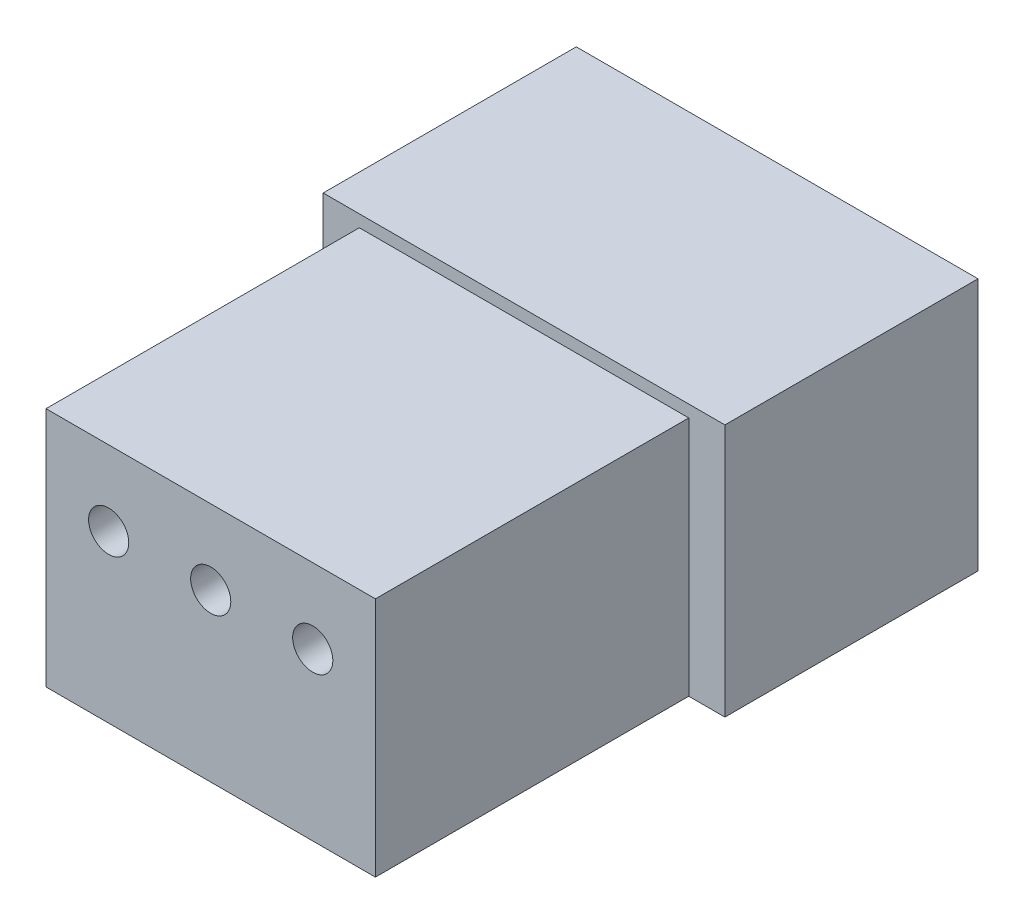
ISO-10303-21;
HEADER;
FILE_DESCRIPTION(('STEP AP214'),'2;1');
FILE_NAME('part.step','',(''),(''),'','','');
FILE_SCHEMA(('AUTOMOTIVE_DESIGN { 1 0 10303 214 1 1 1 1 }'));
ENDSEC;
DATA;
#1=APPLICATION_CONTEXT('core data for automotive mechanical design processes');
#2=APPLICATION_PROTOCOL_DEFINITION('international standard','automotive_design',2000,#1);
#3=PRODUCT_CONTEXT('',#1,'mechanical');
#4=PRODUCT('Part','Part','',(#3));
#5=PRODUCT_RELATED_PRODUCT_CATEGORY('part','',(#4));
#6=PRODUCT_DEFINITION_FORMATION('','',#4);
#7=PRODUCT_DEFINITION_CONTEXT('part definition',#1,'design');
#8=PRODUCT_DEFINITION('design','',#6,#7);
#9=PRODUCT_DEFINITION_SHAPE('','',#8);
#10=(LENGTH_UNIT() NAMED_UNIT(*) SI_UNIT(.MILLI.,.METRE.));
#11=(NAMED_UNIT(*) PLANE_ANGLE_UNIT() SI_UNIT($,.RADIAN.));
#12=(NAMED_UNIT(*) SI_UNIT($,.STERADIAN.) SOLID_ANGLE_UNIT());
#13=UNCERTAINTY_MEASURE_WITH_UNIT(LENGTH_MEASURE(1.E-05),#10,'distance_accuracy_value','');
#14=(GEOMETRIC_REPRESENTATION_CONTEXT(3) GLOBAL_UNCERTAINTY_ASSIGNED_CONTEXT((#13)) GLOBAL_UNIT_ASSIGNED_CONTEXT((#10,
#11,#12)) REPRESENTATION_CONTEXT('',''));
#15=CARTESIAN_POINT('',(0.,0.,0.));
#16=DIRECTION('',(0.,0.,1.));
#17=DIRECTION('',(1.,0.,0.));
#18=AXIS2_PLACEMENT_3D('',#15,#16,#17);
#19=CARTESIAN_POINT('',(0.,0.,6.3));
#20=DIRECTION('',(0.,0.,-1.));
#21=DIRECTION('',(-1.,0.,0.));
#22=AXIS2_PLACEMENT_3D('',#19,#20,#21);
#23=PLANE('',#22);
#24=DIRECTION('',(0.,-1.,0.));
#25=VECTOR('',#24,1.);
#26=CARTESIAN_POINT('',(0.9,6.,6.3));
#27=LINE('',#26,#25);
#28=CARTESIAN_POINT('',(0.9,6.,6.3));
#29=VERTEX_POINT('',#28);
#30=CARTESIAN_POINT('',(0.9,0.,6.3));
#31=VERTEX_POINT('',#30);
#32=EDGE_CURVE('E52',#29,#31,#27,.T.);
#33=ORIENTED_EDGE('',*,*,#32,.F.);
#34=DIRECTION('',(-1.,0.,0.));
#35=VECTOR('',#34,1.);
#36=CARTESIAN_POINT('',(0.9,6.,6.3));
#37=LINE('',#36,#35);
#38=CARTESIAN_POINT('',(9.1,6.,6.3));
#39=VERTEX_POINT('',#38);
#40=EDGE_CURVE('E153',#39,#29,#37,.T.);
#41=ORIENTED_EDGE('',*,*,#40,.F.);
#42=DIRECTION('',(0.,1.,0.));
#43=VECTOR('',#42,1.);
#44=CARTESIAN_POINT('',(9.1,6.,6.3));
#45=LINE('',#44,#43);
#46=CARTESIAN_POINT('',(9.1,0.,6.3));
#47=VERTEX_POINT('',#46);
#48=EDGE_CURVE('E173',#47,#39,#45,.T.);
#49=ORIENTED_EDGE('',*,*,#48,.F.);
#50=DIRECTION('',(1.,0.,0.));
#51=VECTOR('',#50,1.);
#52=CARTESIAN_POINT('',(0.,0.,6.3));
#53=LINE('',#52,#51);
#54=CARTESIAN_POINT('',(10.,0.,6.3));
#55=VERTEX_POINT('',#54);
#56=EDGE_CURVE('E201',#47,#55,#53,.T.);
#57=ORIENTED_EDGE('',*,*,#56,.T.);
#58=DIRECTION('',(0.,1.,0.));
#59=VECTOR('',#58,1.);
#60=CARTESIAN_POINT('',(10.,0.,6.3));
#61=LINE('',#60,#59);
#62=CARTESIAN_POINT('',(10.,6.3,6.3));
#63=VERTEX_POINT('',#62);
#64=EDGE_CURVE('E210',#55,#63,#61,.T.);
#65=ORIENTED_EDGE('',*,*,#64,.T.);
#66=DIRECTION('',(-1.,0.,0.));
#67=VECTOR('',#66,1.);
#68=CARTESIAN_POINT('',(0.,6.3,6.3));
#69=LINE('',#68,#67);
#70=CARTESIAN_POINT('',(0.,6.3,6.3));
#71=VERTEX_POINT('',#70);
#72=EDGE_CURVE('E207',#63,#71,#69,.T.);
#73=ORIENTED_EDGE('',*,*,#72,.T.);
#74=DIRECTION('',(0.,-1.,0.));
#75=VECTOR('',#74,1.);
#76=CARTESIAN_POINT('',(0.,0.,6.3));
#77=LINE('',#76,#75);
#78=CARTESIAN_POINT('',(0.,0.,6.3));
#79=VERTEX_POINT('',#78);
#80=EDGE_CURVE('E199',#71,#79,#77,.T.);
#81=ORIENTED_EDGE('',*,*,#80,.T.);
#82=EDGE_CURVE('E202',#79,#31,#53,.T.);
#83=ORIENTED_EDGE('',*,*,#82,.T.);
#84=EDGE_LOOP('',(#33,#41,#49,#57,#65,#73,#81,#83));
#85=FACE_BOUND('',#84,.T.);
#86=ADVANCED_FACE('F45',(#85),#23,.F.);
#87=CARTESIAN_POINT('',(0.,0.,0.));
#88=DIRECTION('',(0.,0.,-1.));
#89=DIRECTION('',(-1.,0.,0.));
#90=AXIS2_PLACEMENT_3D('',#87,#88,#89);
#91=PLANE('',#90);
#92=DIRECTION('',(0.,-1.,0.));
#93=VECTOR('',#92,1.);
#94=CARTESIAN_POINT('',(0.,0.,0.));
#95=LINE('',#94,#93);
#96=CARTESIAN_POINT('',(0.,6.3,0.));
#97=VERTEX_POINT('',#96);
#98=CARTESIAN_POINT('',(0.,0.,0.));
#99=VERTEX_POINT('',#98);
#100=EDGE_CURVE('E200',#97,#99,#95,.T.);
#101=ORIENTED_EDGE('',*,*,#100,.F.);
#102=DIRECTION('',(-1.,0.,0.));
#103=VECTOR('',#102,1.);
#104=CARTESIAN_POINT('',(0.,6.3,0.));
#105=LINE('',#104,#103);
#106=CARTESIAN_POINT('',(10.,6.3,0.));
#107=VERTEX_POINT('',#106);
#108=EDGE_CURVE('E204',#107,#97,#105,.T.);
#109=ORIENTED_EDGE('',*,*,#108,.F.);
#110=DIRECTION('',(0.,1.,0.));
#111=VECTOR('',#110,1.);
#112=CARTESIAN_POINT('',(10.,0.,0.));
#113=LINE('',#112,#111);
#114=CARTESIAN_POINT('',(10.,0.,0.));
#115=VERTEX_POINT('',#114);
#116=EDGE_CURVE('E220',#115,#107,#113,.T.);
#117=ORIENTED_EDGE('',*,*,#116,.F.);
#118=DIRECTION('',(1.,0.,0.));
#119=VECTOR('',#118,1.);
#120=CARTESIAN_POINT('',(0.,0.,0.));
#121=LINE('',#120,#119);
#122=EDGE_CURVE('E212',#99,#115,#121,.T.);
#123=ORIENTED_EDGE('',*,*,#122,.F.);
#124=EDGE_LOOP('',(#101,#109,#117,#123));
#125=FACE_BOUND('',#124,.T.);
#126=DIRECTION('',(-1.,0.,0.));
#127=VECTOR('',#126,1.);
#128=CARTESIAN_POINT('',(0.7,4.9,0.));
#129=LINE('',#128,#127);
#130=CARTESIAN_POINT('',(9.3,4.9,0.));
#131=VERTEX_POINT('',#130);
#132=CARTESIAN_POINT('',(0.7,4.9,0.));
#133=VERTEX_POINT('',#132);
#134=EDGE_CURVE('E136',#131,#133,#129,.T.);
#135=ORIENTED_EDGE('',*,*,#134,.T.);
#136=DIRECTION('',(0.,-1.,0.));
#137=VECTOR('',#136,1.);
#138=CARTESIAN_POINT('',(0.7,4.9,0.));
#139=LINE('',#138,#137);
#140=CARTESIAN_POINT('',(0.7,1.,0.));
#141=VERTEX_POINT('',#140);
#142=EDGE_CURVE('E188',#133,#141,#139,.T.);
#143=ORIENTED_EDGE('',*,*,#142,.T.);
#144=DIRECTION('',(1.,0.,0.));
#145=VECTOR('',#144,1.);
#146=CARTESIAN_POINT('',(0.7,1.,0.));
#147=LINE('',#146,#145);
#148=CARTESIAN_POINT('',(9.3,1.,0.));
#149=VERTEX_POINT('',#148);
#150=EDGE_CURVE('E190',#141,#149,#147,.T.);
#151=ORIENTED_EDGE('',*,*,#150,.T.);
#152=DIRECTION('',(0.,1.,0.));
#153=VECTOR('',#152,1.);
#154=CARTESIAN_POINT('',(9.3,4.9,0.));
#155=LINE('',#154,#153);
#156=EDGE_CURVE('E194',#149,#131,#155,.T.);
#157=ORIENTED_EDGE('',*,*,#156,.T.);
#158=EDGE_LOOP('',(#135,#143,#151,#157));
#159=FACE_BOUND('',#158,.T.);
#160=ADVANCED_FACE('F320',(#125,#159),#91,.T.);
#161=CARTESIAN_POINT('',(0.,0.,6.3));
#162=DIRECTION('',(1.,0.,0.));
#163=DIRECTION('',(0.,0.,-1.));
#164=AXIS2_PLACEMENT_3D('',#161,#162,#163);
#165=PLANE('',#164);
#166=ORIENTED_EDGE('',*,*,#100,.T.);
#167=DIRECTION('',(0.,0.,-1.));
#168=VECTOR('',#167,1.);
#169=CARTESIAN_POINT('',(0.,0.,6.3));
#170=LINE('',#169,#168);
#171=EDGE_CURVE('E172',#79,#99,#170,.T.);
#172=ORIENTED_EDGE('',*,*,#171,.F.);
#173=ORIENTED_EDGE('',*,*,#80,.F.);
#174=DIRECTION('',(0.,0.,-1.));
#175=VECTOR('',#174,1.);
#176=CARTESIAN_POINT('',(0.,6.3,6.3));
#177=LINE('',#176,#175);
#178=EDGE_CURVE('E211',#71,#97,#177,.T.);
#179=ORIENTED_EDGE('',*,*,#178,.T.);
#180=EDGE_LOOP('',(#166,#172,#173,#179));
#181=FACE_BOUND('',#180,.T.);
#182=ADVANCED_FACE('F42',(#181),#165,.F.);
#183=CARTESIAN_POINT('',(0.,0.,6.3));
#184=DIRECTION('',(0.,1.,0.));
#185=DIRECTION('',(0.,0.,1.));
#186=AXIS2_PLACEMENT_3D('',#183,#184,#185);
#187=PLANE('',#186);
#188=ORIENTED_EDGE('',*,*,#122,.T.);
#189=DIRECTION('',(0.,0.,-1.));
#190=VECTOR('',#189,1.);
#191=CARTESIAN_POINT('',(10.,0.,6.3));
#192=LINE('',#191,#190);
#193=EDGE_CURVE('E223',#55,#115,#192,.T.);
#194=ORIENTED_EDGE('',*,*,#193,.F.);
#195=ORIENTED_EDGE('',*,*,#56,.F.);
#196=DIRECTION('',(0.,0.,-1.));
#197=VECTOR('',#196,1.);
#198=CARTESIAN_POINT('',(9.1,0.,14.1));
#199=LINE('',#198,#197);
#200=CARTESIAN_POINT('',(9.1,0.,14.1));
#201=VERTEX_POINT('',#200);
#202=EDGE_CURVE('E178',#201,#47,#199,.T.);
#203=ORIENTED_EDGE('',*,*,#202,.F.);
#204=DIRECTION('',(1.,0.,0.));
#205=VECTOR('',#204,1.);
#206=CARTESIAN_POINT('',(0.900000000000001,0.,14.1));
#207=LINE('',#206,#205);
#208=CARTESIAN_POINT('',(0.900000000000001,0.,14.1));
#209=VERTEX_POINT('',#208);
#210=EDGE_CURVE('E165',#209,#201,#207,.T.);
#211=ORIENTED_EDGE('',*,*,#210,.F.);
#212=DIRECTION('',(0.,0.,-1.));
#213=VECTOR('',#212,1.);
#214=CARTESIAN_POINT('',(0.900000000000001,0.,14.1));
#215=LINE('',#214,#213);
#216=EDGE_CURVE('E181',#209,#31,#215,.T.);
#217=ORIENTED_EDGE('',*,*,#216,.T.);
#218=ORIENTED_EDGE('',*,*,#82,.F.);
#219=ORIENTED_EDGE('',*,*,#171,.T.);
#220=EDGE_LOOP('',(#188,#194,#195,#203,#211,#217,#218,#219));
#221=FACE_BOUND('',#220,.T.);
#222=ADVANCED_FACE('F339',(#221),#187,.F.);
#223=CARTESIAN_POINT('',(10.,0.,6.3));
#224=DIRECTION('',(-1.,0.,0.));
#225=DIRECTION('',(0.,0.,1.));
#226=AXIS2_PLACEMENT_3D('',#223,#224,#225);
#227=PLANE('',#226);
#228=ORIENTED_EDGE('',*,*,#116,.T.);
#229=DIRECTION('',(0.,0.,-1.));
#230=VECTOR('',#229,1.);
#231=CARTESIAN_POINT('',(10.,6.3,6.3));
#232=LINE('',#231,#230);
#233=EDGE_CURVE('E224',#63,#107,#232,.T.);
#234=ORIENTED_EDGE('',*,*,#233,.F.);
#235=ORIENTED_EDGE('',*,*,#64,.F.);
#236=ORIENTED_EDGE('',*,*,#193,.T.);
#237=EDGE_LOOP('',(#228,#234,#235,#236));
#238=FACE_BOUND('',#237,.T.);
#239=ADVANCED_FACE('F331',(#238),#227,.F.);
#240=CARTESIAN_POINT('',(0.,6.3,6.3));
#241=DIRECTION('',(0.,-1.,0.));
#242=DIRECTION('',(0.,0.,-1.));
#243=AXIS2_PLACEMENT_3D('',#240,#241,#242);
#244=PLANE('',#243);
#245=ORIENTED_EDGE('',*,*,#108,.T.);
#246=ORIENTED_EDGE('',*,*,#178,.F.);
#247=ORIENTED_EDGE('',*,*,#72,.F.);
#248=ORIENTED_EDGE('',*,*,#233,.T.);
#249=EDGE_LOOP('',(#245,#246,#247,#248));
#250=FACE_BOUND('',#249,.T.);
#251=ADVANCED_FACE('F332',(#250),#244,.F.);
#252=CARTESIAN_POINT('',(0.7,4.9,6.3));
#253=DIRECTION('',(1.,0.,0.));
#254=DIRECTION('',(0.,1.,0.));
#255=AXIS2_PLACEMENT_3D('',#252,#253,#254);
#256=PLANE('',#255);
#257=DIRECTION('',(0.,1.,0.));
#258=VECTOR('',#257,1.);
#259=CARTESIAN_POINT('',(0.7,4.9,5.3));
#260=LINE('',#259,#258);
#261=CARTESIAN_POINT('',(0.7,1.,5.3));
#262=VERTEX_POINT('',#261);
#263=CARTESIAN_POINT('',(0.7,4.9,5.3));
#264=VERTEX_POINT('',#263);
#265=EDGE_CURVE('E63',#262,#264,#260,.T.);
#266=ORIENTED_EDGE('',*,*,#265,.F.);
#267=DIRECTION('',(0.,0.,-1.));
#268=VECTOR('',#267,1.);
#269=CARTESIAN_POINT('',(0.7,1.,6.3));
#270=LINE('',#269,#268);
#271=EDGE_CURVE('E197',#262,#141,#270,.T.);
#272=ORIENTED_EDGE('',*,*,#271,.T.);
#273=ORIENTED_EDGE('',*,*,#142,.F.);
#274=DIRECTION('',(0.,0.,-1.));
#275=VECTOR('',#274,1.);
#276=CARTESIAN_POINT('',(0.7,4.9,6.3));
#277=LINE('',#276,#275);
#278=EDGE_CURVE('E145',#264,#133,#277,.T.);
#279=ORIENTED_EDGE('',*,*,#278,.F.);
#280=EDGE_LOOP('',(#266,#272,#273,#279));
#281=FACE_BOUND('',#280,.T.);
#282=ADVANCED_FACE('F327',(#281),#256,.T.);
#283=CARTESIAN_POINT('',(0.7,1.,6.3));
#284=DIRECTION('',(0.,1.,0.));
#285=DIRECTION('',(0.,0.,1.));
#286=AXIS2_PLACEMENT_3D('',#283,#284,#285);
#287=PLANE('',#286);
#288=DIRECTION('',(-1.,0.,0.));
#289=VECTOR('',#288,1.);
#290=CARTESIAN_POINT('',(0.7,1.,5.3));
#291=LINE('',#290,#289);
#292=CARTESIAN_POINT('',(9.3,1.,5.3));
#293=VERTEX_POINT('',#292);
#294=EDGE_CURVE('E70',#293,#262,#291,.T.);
#295=ORIENTED_EDGE('',*,*,#294,.F.);
#296=DIRECTION('',(0.,0.,-1.));
#297=VECTOR('',#296,1.);
#298=CARTESIAN_POINT('',(9.3,1.,6.3));
#299=LINE('',#298,#297);
#300=EDGE_CURVE('E141',#293,#149,#299,.T.);
#301=ORIENTED_EDGE('',*,*,#300,.T.);
#302=ORIENTED_EDGE('',*,*,#150,.F.);
#303=ORIENTED_EDGE('',*,*,#271,.F.);
#304=EDGE_LOOP('',(#295,#301,#302,#303));
#305=FACE_BOUND('',#304,.T.);
#306=ADVANCED_FACE('F379',(#305),#287,.T.);
#307=CARTESIAN_POINT('',(9.3,4.9,6.3));
#308=DIRECTION('',(-1.,0.,0.));
#309=DIRECTION('',(0.,-1.,0.));
#310=AXIS2_PLACEMENT_3D('',#307,#308,#309);
#311=PLANE('',#310);
#312=DIRECTION('',(0.,-1.,0.));
#313=VECTOR('',#312,1.);
#314=CARTESIAN_POINT('',(9.3,4.9,5.3));
#315=LINE('',#314,#313);
#316=CARTESIAN_POINT('',(9.3,4.9,5.3));
#317=VERTEX_POINT('',#316);
#318=EDGE_CURVE('E150',#317,#293,#315,.T.);
#319=ORIENTED_EDGE('',*,*,#318,.F.);
#320=DIRECTION('',(0.,0.,-1.));
#321=VECTOR('',#320,1.);
#322=CARTESIAN_POINT('',(9.3,4.9,6.3));
#323=LINE('',#322,#321);
#324=EDGE_CURVE('E131',#317,#131,#323,.T.);
#325=ORIENTED_EDGE('',*,*,#324,.T.);
#326=ORIENTED_EDGE('',*,*,#156,.F.);
#327=ORIENTED_EDGE('',*,*,#300,.F.);
#328=EDGE_LOOP('',(#319,#325,#326,#327));
#329=FACE_BOUND('',#328,.T.);
#330=ADVANCED_FACE('F146',(#329),#311,.T.);
#331=CARTESIAN_POINT('',(0.7,4.9,6.3));
#332=DIRECTION('',(0.,-1.,0.));
#333=DIRECTION('',(0.,0.,-1.));
#334=AXIS2_PLACEMENT_3D('',#331,#332,#333);
#335=PLANE('',#334);
#336=DIRECTION('',(1.,0.,0.));
#337=VECTOR('',#336,1.);
#338=CARTESIAN_POINT('',(0.7,4.9,5.3));
#339=LINE('',#338,#337);
#340=EDGE_CURVE('E11',#264,#317,#339,.T.);
#341=ORIENTED_EDGE('',*,*,#340,.F.);
#342=ORIENTED_EDGE('',*,*,#278,.T.);
#343=ORIENTED_EDGE('',*,*,#134,.F.);
#344=ORIENTED_EDGE('',*,*,#324,.F.);
#345=EDGE_LOOP('',(#341,#342,#343,#344));
#346=FACE_BOUND('',#345,.T.);
#347=ADVANCED_FACE('F139',(#346),#335,.T.);
#348=CARTESIAN_POINT('',(0.9,6.,14.1));
#349=DIRECTION('',(1.,0.,0.));
#350=DIRECTION('',(0.,1.,0.));
#351=AXIS2_PLACEMENT_3D('',#348,#349,#350);
#352=PLANE('',#351);
#353=DIRECTION('',(0.,0.,-1.));
#354=VECTOR('',#353,1.);
#355=CARTESIAN_POINT('',(0.9,6.,14.1));
#356=LINE('',#355,#354);
#357=CARTESIAN_POINT('',(0.9,6.,14.1));
#358=VERTEX_POINT('',#357);
#359=EDGE_CURVE('E169',#358,#29,#356,.T.);
#360=ORIENTED_EDGE('',*,*,#359,.T.);
#361=ORIENTED_EDGE('',*,*,#32,.T.);
#362=ORIENTED_EDGE('',*,*,#216,.F.);
#363=DIRECTION('',(0.,-1.,0.));
#364=VECTOR('',#363,1.);
#365=CARTESIAN_POINT('',(0.9,6.,14.1));
#366=LINE('',#365,#364);
#367=EDGE_CURVE('E156',#358,#209,#366,.T.);
#368=ORIENTED_EDGE('',*,*,#367,.F.);
#369=EDGE_LOOP('',(#360,#361,#362,#368));
#370=FACE_BOUND('',#369,.T.);
#371=ADVANCED_FACE('F370',(#370),#352,.F.);
#372=CARTESIAN_POINT('',(9.1,6.,14.1));
#373=DIRECTION('',(-1.,0.,0.));
#374=DIRECTION('',(0.,0.,1.));
#375=AXIS2_PLACEMENT_3D('',#372,#373,#374);
#376=PLANE('',#375);
#377=ORIENTED_EDGE('',*,*,#202,.T.);
#378=ORIENTED_EDGE('',*,*,#48,.T.);
#379=DIRECTION('',(0.,0.,-1.));
#380=VECTOR('',#379,1.);
#381=CARTESIAN_POINT('',(9.1,6.,14.1));
#382=LINE('',#381,#380);
#383=CARTESIAN_POINT('',(9.1,6.,14.1));
#384=VERTEX_POINT('',#383);
#385=EDGE_CURVE('E179',#384,#39,#382,.T.);
#386=ORIENTED_EDGE('',*,*,#385,.F.);
#387=DIRECTION('',(0.,1.,0.));
#388=VECTOR('',#387,1.);
#389=CARTESIAN_POINT('',(9.1,6.,14.1));
#390=LINE('',#389,#388);
#391=EDGE_CURVE('E163',#201,#384,#390,.T.);
#392=ORIENTED_EDGE('',*,*,#391,.F.);
#393=EDGE_LOOP('',(#377,#378,#386,#392));
#394=FACE_BOUND('',#393,.T.);
#395=ADVANCED_FACE('F356',(#394),#376,.F.);
#396=CARTESIAN_POINT('',(0.9,6.,14.1));
#397=DIRECTION('',(0.,-1.,0.));
#398=DIRECTION('',(0.,0.,-1.));
#399=AXIS2_PLACEMENT_3D('',#396,#397,#398);
#400=PLANE('',#399);
#401=ORIENTED_EDGE('',*,*,#40,.T.);
#402=ORIENTED_EDGE('',*,*,#359,.F.);
#403=DIRECTION('',(-1.,0.,0.));
#404=VECTOR('',#403,1.);
#405=CARTESIAN_POINT('',(0.9,6.,14.1));
#406=LINE('',#405,#404);
#407=EDGE_CURVE('E167',#384,#358,#406,.T.);
#408=ORIENTED_EDGE('',*,*,#407,.F.);
#409=ORIENTED_EDGE('',*,*,#385,.T.);
#410=EDGE_LOOP('',(#401,#402,#408,#409));
#411=FACE_BOUND('',#410,.T.);
#412=ADVANCED_FACE('F260',(#411),#400,.F.);
#413=CARTESIAN_POINT('',(0.,0.,14.1));
#414=DIRECTION('',(0.,0.,1.));
#415=DIRECTION('',(1.,0.,0.));
#416=AXIS2_PLACEMENT_3D('',#413,#414,#415);
#417=PLANE('',#416);
#418=CARTESIAN_POINT('',(2.46,4.13821057896716,14.100012));
#419=DIRECTION('',(0.,0.,1.));
#420=DIRECTION('',(1.,0.,0.));
#421=AXIS2_PLACEMENT_3D('',#418,#419,#420);
#422=CIRCLE('',#421,0.5);
#423=CARTESIAN_POINT('',(2.96,4.13821057896716,14.100012));
#424=VERTEX_POINT('',#423);
#425=EDGE_CURVE('E234',#424,#424,#422,.T.);
#426=ORIENTED_EDGE('',*,*,#425,.F.);
#427=EDGE_LOOP('',(#426));
#428=FACE_BOUND('',#427,.T.);
#429=CARTESIAN_POINT('',(5.,4.13821057896716,14.100012));
#430=DIRECTION('',(0.,0.,1.));
#431=DIRECTION('',(1.,0.,0.));
#432=AXIS2_PLACEMENT_3D('',#429,#430,#431);
#433=CIRCLE('',#432,0.5);
#434=CARTESIAN_POINT('',(5.5,4.13821057896716,14.100012));
#435=VERTEX_POINT('',#434);
#436=EDGE_CURVE('E274',#435,#435,#433,.T.);
#437=ORIENTED_EDGE('',*,*,#436,.F.);
#438=EDGE_LOOP('',(#437));
#439=FACE_BOUND('',#438,.T.);
#440=CARTESIAN_POINT('',(7.54,4.13821057896716,14.100012));
#441=DIRECTION('',(0.,0.,1.));
#442=DIRECTION('',(1.,0.,0.));
#443=AXIS2_PLACEMENT_3D('',#440,#441,#442);
#444=CIRCLE('',#443,0.5);
#445=CARTESIAN_POINT('',(8.04,4.13821057896716,14.100012));
#446=VERTEX_POINT('',#445);
#447=EDGE_CURVE('E243',#446,#446,#444,.T.);
#448=ORIENTED_EDGE('',*,*,#447,.F.);
#449=EDGE_LOOP('',(#448));
#450=FACE_BOUND('',#449,.T.);
#451=ORIENTED_EDGE('',*,*,#367,.T.);
#452=ORIENTED_EDGE('',*,*,#210,.T.);
#453=ORIENTED_EDGE('',*,*,#391,.T.);
#454=ORIENTED_EDGE('',*,*,#407,.T.);
#455=EDGE_LOOP('',(#451,#452,#453,#454));
#456=FACE_BOUND('',#455,.T.);
#457=ADVANCED_FACE('F249',(#428,#439,#450,#456),#417,.T.);
#458=CARTESIAN_POINT('',(0.,0.,5.3));
#459=DIRECTION('',(0.,0.,-1.));
#460=DIRECTION('',(-1.,0.,0.));
#461=AXIS2_PLACEMENT_3D('',#458,#459,#460);
#462=PLANE('',#461);
#463=CARTESIAN_POINT('',(2.46,4.13821057896716,5.3));
#464=DIRECTION('',(0.,0.,-1.));
#465=DIRECTION('',(-1.,0.,0.));
#466=AXIS2_PLACEMENT_3D('',#463,#464,#465);
#467=CIRCLE('',#466,0.5);
#468=CARTESIAN_POINT('',(1.96,4.13821057896716,5.3));
#469=VERTEX_POINT('',#468);
#470=EDGE_CURVE('E147',#469,#469,#467,.T.);
#471=ORIENTED_EDGE('',*,*,#470,.F.);
#472=EDGE_LOOP('',(#471));
#473=FACE_BOUND('',#472,.T.);
#474=CARTESIAN_POINT('',(5.,4.13821057896716,5.3));
#475=DIRECTION('',(0.,0.,-1.));
#476=DIRECTION('',(-1.,0.,0.));
#477=AXIS2_PLACEMENT_3D('',#474,#475,#476);
#478=CIRCLE('',#477,0.5);
#479=CARTESIAN_POINT('',(4.5,4.13821057896716,5.3));
#480=VERTEX_POINT('',#479);
#481=EDGE_CURVE('E232',#480,#480,#478,.T.);
#482=ORIENTED_EDGE('',*,*,#481,.F.);
#483=EDGE_LOOP('',(#482));
#484=FACE_BOUND('',#483,.T.);
#485=CARTESIAN_POINT('',(7.54,4.13821057896716,5.3));
#486=DIRECTION('',(0.,0.,-1.));
#487=DIRECTION('',(-1.,0.,0.));
#488=AXIS2_PLACEMENT_3D('',#485,#486,#487);
#489=CIRCLE('',#488,0.500000000000001);
#490=CARTESIAN_POINT('',(7.04,4.13821057896716,5.3));
#491=VERTEX_POINT('',#490);
#492=EDGE_CURVE('E227',#491,#491,#489,.T.);
#493=ORIENTED_EDGE('',*,*,#492,.F.);
#494=EDGE_LOOP('',(#493));
#495=FACE_BOUND('',#494,.T.);
#496=ORIENTED_EDGE('',*,*,#294,.T.);
#497=ORIENTED_EDGE('',*,*,#265,.T.);
#498=ORIENTED_EDGE('',*,*,#340,.T.);
#499=ORIENTED_EDGE('',*,*,#318,.T.);
#500=EDGE_LOOP('',(#496,#497,#498,#499));
#501=FACE_BOUND('',#500,.T.);
#502=ADVANCED_FACE('F155',(#473,#484,#495,#501),#462,.T.);
#503=CARTESIAN_POINT('',(7.54,4.13821057896716,0.));
#504=DIRECTION('',(0.,0.,1.));
#505=DIRECTION('',(1.,0.,0.));
#506=AXIS2_PLACEMENT_3D('',#503,#504,#505);
#507=CYLINDRICAL_SURFACE('',#506,0.500000000000001);
#508=ORIENTED_EDGE('',*,*,#492,.T.);
#509=EDGE_LOOP('',(#508));
#510=FACE_BOUND('',#509,.T.);
#511=ORIENTED_EDGE('',*,*,#447,.T.);
#512=EDGE_LOOP('',(#511));
#513=FACE_BOUND('',#512,.T.);
#514=ADVANCED_FACE('F283',(#510,#513),#507,.F.);
#515=CARTESIAN_POINT('',(5.,4.13821057896716,0.));
#516=DIRECTION('',(0.,0.,1.));
#517=DIRECTION('',(1.,0.,0.));
#518=AXIS2_PLACEMENT_3D('',#515,#516,#517);
#519=CYLINDRICAL_SURFACE('',#518,0.5);
#520=ORIENTED_EDGE('',*,*,#481,.T.);
#521=EDGE_LOOP('',(#520));
#522=FACE_BOUND('',#521,.T.);
#523=ORIENTED_EDGE('',*,*,#436,.T.);
#524=EDGE_LOOP('',(#523));
#525=FACE_BOUND('',#524,.T.);
#526=ADVANCED_FACE('F298',(#522,#525),#519,.F.);
#527=CARTESIAN_POINT('',(2.46,4.13821057896716,0.));
#528=DIRECTION('',(0.,0.,1.));
#529=DIRECTION('',(1.,0.,0.));
#530=AXIS2_PLACEMENT_3D('',#527,#528,#529);
#531=CYLINDRICAL_SURFACE('',#530,0.5);
#532=ORIENTED_EDGE('',*,*,#470,.T.);
#533=EDGE_LOOP('',(#532));
#534=FACE_BOUND('',#533,.T.);
#535=ORIENTED_EDGE('',*,*,#425,.T.);
#536=EDGE_LOOP('',(#535));
#537=FACE_BOUND('',#536,.T.);
#538=ADVANCED_FACE('F302',(#534,#537),#531,.F.);
#539=CLOSED_SHELL('',(#86,#160,#182,#222,#239,#251,#282,#306,#330,#347,#371,#395,#412,#457,#502,
#514,#526,#538));
#540=MANIFOLD_SOLID_BREP('B2',#539);
#541=ADVANCED_BREP_SHAPE_REPRESENTATION('',(#18,#540),#14);
#542=SHAPE_DEFINITION_REPRESENTATION(#9,#541);
ENDSEC;
END-ISO-10303-21;
